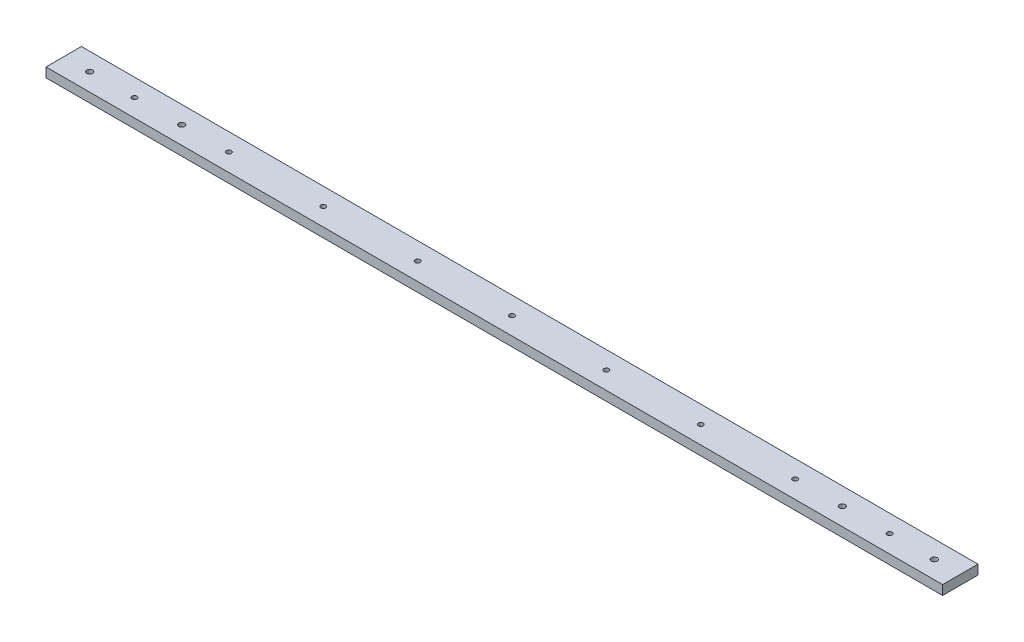
ISO-10303-21;
HEADER;
FILE_DESCRIPTION(('STEP AP214'),'2;1');
FILE_NAME('part.step','',(''),(''),'','','');
FILE_SCHEMA(('AUTOMOTIVE_DESIGN { 1 0 10303 214 1 1 1 1 }'));
ENDSEC;
DATA;
#1=APPLICATION_CONTEXT('core data for automotive mechanical design processes');
#2=APPLICATION_PROTOCOL_DEFINITION('international standard','automotive_design',2000,#1);
#3=PRODUCT_CONTEXT('',#1,'mechanical');
#4=PRODUCT('Part','Part','',(#3));
#5=PRODUCT_RELATED_PRODUCT_CATEGORY('part','',(#4));
#6=PRODUCT_DEFINITION_FORMATION('','',#4);
#7=PRODUCT_DEFINITION_CONTEXT('part definition',#1,'design');
#8=PRODUCT_DEFINITION('design','',#6,#7);
#9=PRODUCT_DEFINITION_SHAPE('','',#8);
#10=(LENGTH_UNIT() NAMED_UNIT(*) SI_UNIT(.MILLI.,.METRE.));
#11=(NAMED_UNIT(*) PLANE_ANGLE_UNIT() SI_UNIT($,.RADIAN.));
#12=(NAMED_UNIT(*) SI_UNIT($,.STERADIAN.) SOLID_ANGLE_UNIT());
#13=UNCERTAINTY_MEASURE_WITH_UNIT(LENGTH_MEASURE(1.E-05),#10,'distance_accuracy_value','');
#14=(GEOMETRIC_REPRESENTATION_CONTEXT(3) GLOBAL_UNCERTAINTY_ASSIGNED_CONTEXT((#13)) GLOBAL_UNIT_ASSIGNED_CONTEXT((#10,
#11,#12)) REPRESENTATION_CONTEXT('',''));
#15=CARTESIAN_POINT('',(0.,0.,0.));
#16=DIRECTION('',(0.,0.,1.));
#17=DIRECTION('',(1.,0.,0.));
#18=AXIS2_PLACEMENT_3D('',#15,#16,#17);
#19=CARTESIAN_POINT('',(380.,8.,-15.));
#20=DIRECTION('',(-1.,0.,0.));
#21=DIRECTION('',(0.,0.,1.));
#22=AXIS2_PLACEMENT_3D('',#19,#20,#21);
#23=PLANE('',#22);
#24=DIRECTION('',(0.,0.,-1.));
#25=VECTOR('',#24,1.);
#26=CARTESIAN_POINT('',(380.,0.,-15.));
#27=LINE('',#26,#25);
#28=CARTESIAN_POINT('',(380.,0.,15.));
#29=VERTEX_POINT('',#28);
#30=CARTESIAN_POINT('',(380.,0.,-15.));
#31=VERTEX_POINT('',#30);
#32=EDGE_CURVE('E111',#29,#31,#27,.T.);
#33=ORIENTED_EDGE('',*,*,#32,.T.);
#34=DIRECTION('',(0.,-1.,0.));
#35=VECTOR('',#34,1.);
#36=CARTESIAN_POINT('',(380.,8.,-15.));
#37=LINE('',#36,#35);
#38=CARTESIAN_POINT('',(380.,8.,-15.));
#39=VERTEX_POINT('',#38);
#40=EDGE_CURVE('E11',#39,#31,#37,.T.);
#41=ORIENTED_EDGE('',*,*,#40,.F.);
#42=DIRECTION('',(0.,0.,-1.));
#43=VECTOR('',#42,1.);
#44=CARTESIAN_POINT('',(380.,8.,-15.));
#45=LINE('',#44,#43);
#46=CARTESIAN_POINT('',(380.,8.,15.));
#47=VERTEX_POINT('',#46);
#48=EDGE_CURVE('E95',#47,#39,#45,.T.);
#49=ORIENTED_EDGE('',*,*,#48,.F.);
#50=DIRECTION('',(0.,-1.,0.));
#51=VECTOR('',#50,1.);
#52=CARTESIAN_POINT('',(380.,8.,15.));
#53=LINE('',#52,#51);
#54=EDGE_CURVE('E107',#47,#29,#53,.T.);
#55=ORIENTED_EDGE('',*,*,#54,.T.);
#56=EDGE_LOOP('',(#33,#41,#49,#55));
#57=FACE_BOUND('',#56,.T.);
#58=ADVANCED_FACE('F43',(#57),#23,.F.);
#59=CARTESIAN_POINT('',(-380.,8.,-15.));
#60=DIRECTION('',(0.,0.,1.));
#61=DIRECTION('',(1.,0.,0.));
#62=AXIS2_PLACEMENT_3D('',#59,#60,#61);
#63=PLANE('',#62);
#64=DIRECTION('',(-1.,0.,0.));
#65=VECTOR('',#64,1.);
#66=CARTESIAN_POINT('',(-380.,0.,-15.));
#67=LINE('',#66,#65);
#68=CARTESIAN_POINT('',(-380.,0.,-15.));
#69=VERTEX_POINT('',#68);
#70=EDGE_CURVE('E100',#31,#69,#67,.T.);
#71=ORIENTED_EDGE('',*,*,#70,.T.);
#72=DIRECTION('',(0.,-1.,0.));
#73=VECTOR('',#72,1.);
#74=CARTESIAN_POINT('',(-380.,8.,-15.));
#75=LINE('',#74,#73);
#76=CARTESIAN_POINT('',(-380.,8.,-15.));
#77=VERTEX_POINT('',#76);
#78=EDGE_CURVE('E52',#77,#69,#75,.T.);
#79=ORIENTED_EDGE('',*,*,#78,.F.);
#80=DIRECTION('',(-1.,0.,0.));
#81=VECTOR('',#80,1.);
#82=CARTESIAN_POINT('',(-380.,8.,-15.));
#83=LINE('',#82,#81);
#84=EDGE_CURVE('E90',#39,#77,#83,.T.);
#85=ORIENTED_EDGE('',*,*,#84,.F.);
#86=ORIENTED_EDGE('',*,*,#40,.T.);
#87=EDGE_LOOP('',(#71,#79,#85,#86));
#88=FACE_BOUND('',#87,.T.);
#89=ADVANCED_FACE('F99',(#88),#63,.F.);
#90=CARTESIAN_POINT('',(-380.,8.,-15.));
#91=DIRECTION('',(1.,0.,0.));
#92=DIRECTION('',(0.,0.,-1.));
#93=AXIS2_PLACEMENT_3D('',#90,#91,#92);
#94=PLANE('',#93);
#95=DIRECTION('',(0.,0.,1.));
#96=VECTOR('',#95,1.);
#97=CARTESIAN_POINT('',(-380.,0.,-15.));
#98=LINE('',#97,#96);
#99=CARTESIAN_POINT('',(-380.,0.,15.));
#100=VERTEX_POINT('',#99);
#101=EDGE_CURVE('E77',#69,#100,#98,.T.);
#102=ORIENTED_EDGE('',*,*,#101,.T.);
#103=DIRECTION('',(0.,-1.,0.));
#104=VECTOR('',#103,1.);
#105=CARTESIAN_POINT('',(-380.,8.,15.));
#106=LINE('',#105,#104);
#107=CARTESIAN_POINT('',(-380.,8.,15.));
#108=VERTEX_POINT('',#107);
#109=EDGE_CURVE('E102',#108,#100,#106,.T.);
#110=ORIENTED_EDGE('',*,*,#109,.F.);
#111=DIRECTION('',(0.,0.,1.));
#112=VECTOR('',#111,1.);
#113=CARTESIAN_POINT('',(-380.,8.,-15.));
#114=LINE('',#113,#112);
#115=EDGE_CURVE('E93',#77,#108,#114,.T.);
#116=ORIENTED_EDGE('',*,*,#115,.F.);
#117=ORIENTED_EDGE('',*,*,#78,.T.);
#118=EDGE_LOOP('',(#102,#110,#116,#117));
#119=FACE_BOUND('',#118,.T.);
#120=ADVANCED_FACE('F103',(#119),#94,.F.);
#121=CARTESIAN_POINT('',(-380.,8.,15.));
#122=DIRECTION('',(0.,0.,-1.));
#123=DIRECTION('',(-1.,0.,0.));
#124=AXIS2_PLACEMENT_3D('',#121,#122,#123);
#125=PLANE('',#124);
#126=DIRECTION('',(1.,0.,0.));
#127=VECTOR('',#126,1.);
#128=CARTESIAN_POINT('',(-380.,0.,15.));
#129=LINE('',#128,#127);
#130=EDGE_CURVE('E83',#100,#29,#129,.T.);
#131=ORIENTED_EDGE('',*,*,#130,.T.);
#132=ORIENTED_EDGE('',*,*,#54,.F.);
#133=DIRECTION('',(1.,0.,0.));
#134=VECTOR('',#133,1.);
#135=CARTESIAN_POINT('',(-380.,8.,15.));
#136=LINE('',#135,#134);
#137=EDGE_CURVE('E60',#108,#47,#136,.T.);
#138=ORIENTED_EDGE('',*,*,#137,.F.);
#139=ORIENTED_EDGE('',*,*,#109,.T.);
#140=EDGE_LOOP('',(#131,#132,#138,#139));
#141=FACE_BOUND('',#140,.T.);
#142=ADVANCED_FACE('F125',(#141),#125,.F.);
#143=CARTESIAN_POINT('',(0.,8.,0.));
#144=DIRECTION('',(0.,1.,0.));
#145=DIRECTION('',(0.,0.,1.));
#146=AXIS2_PLACEMENT_3D('',#143,#144,#145);
#147=PLANE('',#146);
#148=CARTESIAN_POINT('',(0.,8.,0.));
#149=DIRECTION('',(0.,1.,0.));
#150=DIRECTION('',(0.,0.,1.));
#151=AXIS2_PLACEMENT_3D('',#148,#149,#150);
#152=CIRCLE('',#151,2.1);
#153=CARTESIAN_POINT('',(0.,8.,2.1));
#154=VERTEX_POINT('',#153);
#155=EDGE_CURVE('E231',#154,#154,#152,.T.);
#156=ORIENTED_EDGE('',*,*,#155,.F.);
#157=EDGE_LOOP('',(#156));
#158=FACE_BOUND('',#157,.T.);
#159=CARTESIAN_POINT('',(80.,8.,0.));
#160=DIRECTION('',(0.,1.,0.));
#161=DIRECTION('',(0.,0.,1.));
#162=AXIS2_PLACEMENT_3D('',#159,#160,#161);
#163=CIRCLE('',#162,2.1);
#164=CARTESIAN_POINT('',(80.,8.,2.1));
#165=VERTEX_POINT('',#164);
#166=EDGE_CURVE('E223',#165,#165,#163,.T.);
#167=ORIENTED_EDGE('',*,*,#166,.F.);
#168=EDGE_LOOP('',(#167));
#169=FACE_BOUND('',#168,.T.);
#170=CARTESIAN_POINT('',(160.,8.,0.));
#171=DIRECTION('',(0.,1.,0.));
#172=DIRECTION('',(0.,0.,1.));
#173=AXIS2_PLACEMENT_3D('',#170,#171,#172);
#174=CIRCLE('',#173,2.09999999999999);
#175=CARTESIAN_POINT('',(160.,8.,2.09999999999999));
#176=VERTEX_POINT('',#175);
#177=EDGE_CURVE('E215',#176,#176,#174,.T.);
#178=ORIENTED_EDGE('',*,*,#177,.F.);
#179=EDGE_LOOP('',(#178));
#180=FACE_BOUND('',#179,.T.);
#181=CARTESIAN_POINT('',(240.,8.,0.));
#182=DIRECTION('',(0.,1.,0.));
#183=DIRECTION('',(0.,0.,1.));
#184=AXIS2_PLACEMENT_3D('',#181,#182,#183);
#185=CIRCLE('',#184,2.09999999999999);
#186=CARTESIAN_POINT('',(240.,8.,2.09999999999999));
#187=VERTEX_POINT('',#186);
#188=EDGE_CURVE('E207',#187,#187,#185,.T.);
#189=ORIENTED_EDGE('',*,*,#188,.F.);
#190=EDGE_LOOP('',(#189));
#191=FACE_BOUND('',#190,.T.);
#192=CARTESIAN_POINT('',(320.,8.,0.));
#193=DIRECTION('',(0.,1.,0.));
#194=DIRECTION('',(0.,0.,1.));
#195=AXIS2_PLACEMENT_3D('',#192,#193,#194);
#196=CIRCLE('',#195,2.09999999999999);
#197=CARTESIAN_POINT('',(320.,8.,2.09999999999999));
#198=VERTEX_POINT('',#197);
#199=EDGE_CURVE('E199',#198,#198,#196,.T.);
#200=ORIENTED_EDGE('',*,*,#199,.F.);
#201=EDGE_LOOP('',(#200));
#202=FACE_BOUND('',#201,.T.);
#203=CARTESIAN_POINT('',(-80.,8.,0.));
#204=DIRECTION('',(0.,1.,0.));
#205=DIRECTION('',(0.,0.,1.));
#206=AXIS2_PLACEMENT_3D('',#203,#204,#205);
#207=CIRCLE('',#206,2.1);
#208=CARTESIAN_POINT('',(-80.,8.,2.1));
#209=VERTEX_POINT('',#208);
#210=EDGE_CURVE('E191',#209,#209,#207,.T.);
#211=ORIENTED_EDGE('',*,*,#210,.F.);
#212=EDGE_LOOP('',(#211));
#213=FACE_BOUND('',#212,.T.);
#214=CARTESIAN_POINT('',(-160.,8.,0.));
#215=DIRECTION('',(0.,1.,0.));
#216=DIRECTION('',(0.,0.,1.));
#217=AXIS2_PLACEMENT_3D('',#214,#215,#216);
#218=CIRCLE('',#217,2.09999999999999);
#219=CARTESIAN_POINT('',(-160.,8.,2.09999999999999));
#220=VERTEX_POINT('',#219);
#221=EDGE_CURVE('E183',#220,#220,#218,.T.);
#222=ORIENTED_EDGE('',*,*,#221,.F.);
#223=EDGE_LOOP('',(#222));
#224=FACE_BOUND('',#223,.T.);
#225=CARTESIAN_POINT('',(-240.,8.,0.));
#226=DIRECTION('',(0.,1.,0.));
#227=DIRECTION('',(0.,0.,1.));
#228=AXIS2_PLACEMENT_3D('',#225,#226,#227);
#229=CIRCLE('',#228,2.09999999999999);
#230=CARTESIAN_POINT('',(-240.,8.,2.09999999999999));
#231=VERTEX_POINT('',#230);
#232=EDGE_CURVE('E175',#231,#231,#229,.T.);
#233=ORIENTED_EDGE('',*,*,#232,.F.);
#234=EDGE_LOOP('',(#233));
#235=FACE_BOUND('',#234,.T.);
#236=CARTESIAN_POINT('',(-320.,8.,0.));
#237=DIRECTION('',(0.,1.,0.));
#238=DIRECTION('',(0.,0.,1.));
#239=AXIS2_PLACEMENT_3D('',#236,#237,#238);
#240=CIRCLE('',#239,2.09999999999999);
#241=CARTESIAN_POINT('',(-320.,8.,2.09999999999999));
#242=VERTEX_POINT('',#241);
#243=EDGE_CURVE('E167',#242,#242,#240,.T.);
#244=ORIENTED_EDGE('',*,*,#243,.F.);
#245=EDGE_LOOP('',(#244));
#246=FACE_BOUND('',#245,.T.);
#247=CARTESIAN_POINT('',(-358.,8.,0.));
#248=DIRECTION('',(0.,1.,0.));
#249=DIRECTION('',(0.,0.,1.));
#250=AXIS2_PLACEMENT_3D('',#247,#248,#249);
#251=CIRCLE('',#250,2.5);
#252=CARTESIAN_POINT('',(-358.,8.,2.5));
#253=VERTEX_POINT('',#252);
#254=EDGE_CURVE('E159',#253,#253,#251,.T.);
#255=ORIENTED_EDGE('',*,*,#254,.F.);
#256=EDGE_LOOP('',(#255));
#257=FACE_BOUND('',#256,.T.);
#258=CARTESIAN_POINT('',(-280.,8.,0.));
#259=DIRECTION('',(0.,1.,0.));
#260=DIRECTION('',(0.,0.,1.));
#261=AXIS2_PLACEMENT_3D('',#258,#259,#260);
#262=CIRCLE('',#261,2.5);
#263=CARTESIAN_POINT('',(-280.,8.,2.5));
#264=VERTEX_POINT('',#263);
#265=EDGE_CURVE('E151',#264,#264,#262,.T.);
#266=ORIENTED_EDGE('',*,*,#265,.F.);
#267=EDGE_LOOP('',(#266));
#268=FACE_BOUND('',#267,.T.);
#269=CARTESIAN_POINT('',(280.,8.,0.));
#270=DIRECTION('',(0.,1.,0.));
#271=DIRECTION('',(0.,0.,1.));
#272=AXIS2_PLACEMENT_3D('',#269,#270,#271);
#273=CIRCLE('',#272,2.5);
#274=CARTESIAN_POINT('',(280.,8.,2.49999999999993));
#275=VERTEX_POINT('',#274);
#276=EDGE_CURVE('E143',#275,#275,#273,.T.);
#277=ORIENTED_EDGE('',*,*,#276,.F.);
#278=EDGE_LOOP('',(#277));
#279=FACE_BOUND('',#278,.T.);
#280=CARTESIAN_POINT('',(358.,8.,0.));
#281=DIRECTION('',(0.,1.,0.));
#282=DIRECTION('',(0.,0.,1.));
#283=AXIS2_PLACEMENT_3D('',#280,#281,#282);
#284=CIRCLE('',#283,2.5);
#285=CARTESIAN_POINT('',(358.,8.,2.49999999999991));
#286=VERTEX_POINT('',#285);
#287=EDGE_CURVE('E135',#286,#286,#284,.T.);
#288=ORIENTED_EDGE('',*,*,#287,.F.);
#289=EDGE_LOOP('',(#288));
#290=FACE_BOUND('',#289,.T.);
#291=ORIENTED_EDGE('',*,*,#48,.T.);
#292=ORIENTED_EDGE('',*,*,#84,.T.);
#293=ORIENTED_EDGE('',*,*,#115,.T.);
#294=ORIENTED_EDGE('',*,*,#137,.T.);
#295=EDGE_LOOP('',(#291,#292,#293,#294));
#296=FACE_BOUND('',#295,.T.);
#297=ADVANCED_FACE('F91',(#158,#169,#180,#191,#202,#213,#224,#235,#246,#257,#268,#279,#290,
#296),#147,.T.);
#298=CARTESIAN_POINT('',(0.,0.,0.));
#299=DIRECTION('',(0.,1.,0.));
#300=DIRECTION('',(0.,0.,1.));
#301=AXIS2_PLACEMENT_3D('',#298,#299,#300);
#302=PLANE('',#301);
#303=CARTESIAN_POINT('',(0.,0.,0.));
#304=DIRECTION('',(0.,1.,0.));
#305=DIRECTION('',(0.,0.,1.));
#306=AXIS2_PLACEMENT_3D('',#303,#304,#305);
#307=CIRCLE('',#306,2.1);
#308=CARTESIAN_POINT('',(0.,0.,2.1));
#309=VERTEX_POINT('',#308);
#310=EDGE_CURVE('E227',#309,#309,#307,.T.);
#311=ORIENTED_EDGE('',*,*,#310,.T.);
#312=EDGE_LOOP('',(#311));
#313=FACE_BOUND('',#312,.T.);
#314=CARTESIAN_POINT('',(80.,0.,0.));
#315=DIRECTION('',(0.,1.,0.));
#316=DIRECTION('',(0.,0.,1.));
#317=AXIS2_PLACEMENT_3D('',#314,#315,#316);
#318=CIRCLE('',#317,2.1);
#319=CARTESIAN_POINT('',(80.,0.,2.1));
#320=VERTEX_POINT('',#319);
#321=EDGE_CURVE('E219',#320,#320,#318,.T.);
#322=ORIENTED_EDGE('',*,*,#321,.T.);
#323=EDGE_LOOP('',(#322));
#324=FACE_BOUND('',#323,.T.);
#325=CARTESIAN_POINT('',(160.,0.,0.));
#326=DIRECTION('',(0.,1.,0.));
#327=DIRECTION('',(0.,0.,1.));
#328=AXIS2_PLACEMENT_3D('',#325,#326,#327);
#329=CIRCLE('',#328,2.09999999999999);
#330=CARTESIAN_POINT('',(160.,0.,2.09999999999999));
#331=VERTEX_POINT('',#330);
#332=EDGE_CURVE('E211',#331,#331,#329,.T.);
#333=ORIENTED_EDGE('',*,*,#332,.T.);
#334=EDGE_LOOP('',(#333));
#335=FACE_BOUND('',#334,.T.);
#336=CARTESIAN_POINT('',(240.,0.,0.));
#337=DIRECTION('',(0.,1.,0.));
#338=DIRECTION('',(0.,0.,1.));
#339=AXIS2_PLACEMENT_3D('',#336,#337,#338);
#340=CIRCLE('',#339,2.09999999999999);
#341=CARTESIAN_POINT('',(240.,0.,2.09999999999999));
#342=VERTEX_POINT('',#341);
#343=EDGE_CURVE('E203',#342,#342,#340,.T.);
#344=ORIENTED_EDGE('',*,*,#343,.T.);
#345=EDGE_LOOP('',(#344));
#346=FACE_BOUND('',#345,.T.);
#347=CARTESIAN_POINT('',(320.,0.,0.));
#348=DIRECTION('',(0.,1.,0.));
#349=DIRECTION('',(0.,0.,1.));
#350=AXIS2_PLACEMENT_3D('',#347,#348,#349);
#351=CIRCLE('',#350,2.09999999999999);
#352=CARTESIAN_POINT('',(320.,0.,2.09999999999999));
#353=VERTEX_POINT('',#352);
#354=EDGE_CURVE('E195',#353,#353,#351,.T.);
#355=ORIENTED_EDGE('',*,*,#354,.T.);
#356=EDGE_LOOP('',(#355));
#357=FACE_BOUND('',#356,.T.);
#358=CARTESIAN_POINT('',(-80.,0.,0.));
#359=DIRECTION('',(0.,1.,0.));
#360=DIRECTION('',(0.,0.,1.));
#361=AXIS2_PLACEMENT_3D('',#358,#359,#360);
#362=CIRCLE('',#361,2.1);
#363=CARTESIAN_POINT('',(-80.,0.,2.1));
#364=VERTEX_POINT('',#363);
#365=EDGE_CURVE('E187',#364,#364,#362,.T.);
#366=ORIENTED_EDGE('',*,*,#365,.T.);
#367=EDGE_LOOP('',(#366));
#368=FACE_BOUND('',#367,.T.);
#369=CARTESIAN_POINT('',(-160.,0.,0.));
#370=DIRECTION('',(0.,1.,0.));
#371=DIRECTION('',(0.,0.,1.));
#372=AXIS2_PLACEMENT_3D('',#369,#370,#371);
#373=CIRCLE('',#372,2.09999999999999);
#374=CARTESIAN_POINT('',(-160.,0.,2.09999999999999));
#375=VERTEX_POINT('',#374);
#376=EDGE_CURVE('E179',#375,#375,#373,.T.);
#377=ORIENTED_EDGE('',*,*,#376,.T.);
#378=EDGE_LOOP('',(#377));
#379=FACE_BOUND('',#378,.T.);
#380=CARTESIAN_POINT('',(-240.,0.,0.));
#381=DIRECTION('',(0.,1.,0.));
#382=DIRECTION('',(0.,0.,1.));
#383=AXIS2_PLACEMENT_3D('',#380,#381,#382);
#384=CIRCLE('',#383,2.09999999999999);
#385=CARTESIAN_POINT('',(-240.,0.,2.09999999999999));
#386=VERTEX_POINT('',#385);
#387=EDGE_CURVE('E171',#386,#386,#384,.T.);
#388=ORIENTED_EDGE('',*,*,#387,.T.);
#389=EDGE_LOOP('',(#388));
#390=FACE_BOUND('',#389,.T.);
#391=CARTESIAN_POINT('',(-320.,0.,0.));
#392=DIRECTION('',(0.,1.,0.));
#393=DIRECTION('',(0.,0.,1.));
#394=AXIS2_PLACEMENT_3D('',#391,#392,#393);
#395=CIRCLE('',#394,2.09999999999999);
#396=CARTESIAN_POINT('',(-320.,0.,2.09999999999999));
#397=VERTEX_POINT('',#396);
#398=EDGE_CURVE('E163',#397,#397,#395,.T.);
#399=ORIENTED_EDGE('',*,*,#398,.T.);
#400=EDGE_LOOP('',(#399));
#401=FACE_BOUND('',#400,.T.);
#402=CARTESIAN_POINT('',(-358.,0.,0.));
#403=DIRECTION('',(0.,1.,0.));
#404=DIRECTION('',(0.,0.,1.));
#405=AXIS2_PLACEMENT_3D('',#402,#403,#404);
#406=CIRCLE('',#405,2.5);
#407=CARTESIAN_POINT('',(-358.,0.,2.5));
#408=VERTEX_POINT('',#407);
#409=EDGE_CURVE('E155',#408,#408,#406,.T.);
#410=ORIENTED_EDGE('',*,*,#409,.T.);
#411=EDGE_LOOP('',(#410));
#412=FACE_BOUND('',#411,.T.);
#413=CARTESIAN_POINT('',(-280.,0.,0.));
#414=DIRECTION('',(0.,1.,0.));
#415=DIRECTION('',(0.,0.,1.));
#416=AXIS2_PLACEMENT_3D('',#413,#414,#415);
#417=CIRCLE('',#416,2.5);
#418=CARTESIAN_POINT('',(-280.,0.,2.5));
#419=VERTEX_POINT('',#418);
#420=EDGE_CURVE('E147',#419,#419,#417,.T.);
#421=ORIENTED_EDGE('',*,*,#420,.T.);
#422=EDGE_LOOP('',(#421));
#423=FACE_BOUND('',#422,.T.);
#424=CARTESIAN_POINT('',(280.,0.,0.));
#425=DIRECTION('',(0.,1.,0.));
#426=DIRECTION('',(0.,0.,1.));
#427=AXIS2_PLACEMENT_3D('',#424,#425,#426);
#428=CIRCLE('',#427,2.5);
#429=CARTESIAN_POINT('',(280.,0.,2.49999999999993));
#430=VERTEX_POINT('',#429);
#431=EDGE_CURVE('E139',#430,#430,#428,.T.);
#432=ORIENTED_EDGE('',*,*,#431,.T.);
#433=EDGE_LOOP('',(#432));
#434=FACE_BOUND('',#433,.T.);
#435=CARTESIAN_POINT('',(358.,0.,0.));
#436=DIRECTION('',(0.,1.,0.));
#437=DIRECTION('',(0.,0.,1.));
#438=AXIS2_PLACEMENT_3D('',#435,#436,#437);
#439=CIRCLE('',#438,2.5);
#440=CARTESIAN_POINT('',(358.,0.,2.49999999999991));
#441=VERTEX_POINT('',#440);
#442=EDGE_CURVE('E115',#441,#441,#439,.T.);
#443=ORIENTED_EDGE('',*,*,#442,.T.);
#444=EDGE_LOOP('',(#443));
#445=FACE_BOUND('',#444,.T.);
#446=ORIENTED_EDGE('',*,*,#32,.F.);
#447=ORIENTED_EDGE('',*,*,#130,.F.);
#448=ORIENTED_EDGE('',*,*,#101,.F.);
#449=ORIENTED_EDGE('',*,*,#70,.F.);
#450=EDGE_LOOP('',(#446,#447,#448,#449));
#451=FACE_BOUND('',#450,.T.);
#452=ADVANCED_FACE('F128',(#313,#324,#335,#346,#357,#368,#379,#390,#401,#412,#423,#434,#445,
#451),#302,.F.);
#453=CARTESIAN_POINT('',(358.,8.,0.));
#454=DIRECTION('',(0.,1.,0.));
#455=DIRECTION('',(0.,0.,1.));
#456=AXIS2_PLACEMENT_3D('',#453,#454,#455);
#457=CYLINDRICAL_SURFACE('',#456,2.5);
#458=ORIENTED_EDGE('',*,*,#442,.F.);
#459=EDGE_LOOP('',(#458));
#460=FACE_BOUND('',#459,.T.);
#461=ORIENTED_EDGE('',*,*,#287,.T.);
#462=EDGE_LOOP('',(#461));
#463=FACE_BOUND('',#462,.T.);
#464=ADVANCED_FACE('F265',(#460,#463),#457,.F.);
#465=CARTESIAN_POINT('',(280.,8.,0.));
#466=DIRECTION('',(0.,1.,0.));
#467=DIRECTION('',(0.,0.,1.));
#468=AXIS2_PLACEMENT_3D('',#465,#466,#467);
#469=CYLINDRICAL_SURFACE('',#468,2.5);
#470=ORIENTED_EDGE('',*,*,#431,.F.);
#471=EDGE_LOOP('',(#470));
#472=FACE_BOUND('',#471,.T.);
#473=ORIENTED_EDGE('',*,*,#276,.T.);
#474=EDGE_LOOP('',(#473));
#475=FACE_BOUND('',#474,.T.);
#476=ADVANCED_FACE('F267',(#472,#475),#469,.F.);
#477=CARTESIAN_POINT('',(-280.,8.,0.));
#478=DIRECTION('',(0.,1.,0.));
#479=DIRECTION('',(0.,0.,1.));
#480=AXIS2_PLACEMENT_3D('',#477,#478,#479);
#481=CYLINDRICAL_SURFACE('',#480,2.5);
#482=ORIENTED_EDGE('',*,*,#420,.F.);
#483=EDGE_LOOP('',(#482));
#484=FACE_BOUND('',#483,.T.);
#485=ORIENTED_EDGE('',*,*,#265,.T.);
#486=EDGE_LOOP('',(#485));
#487=FACE_BOUND('',#486,.T.);
#488=ADVANCED_FACE('F274',(#484,#487),#481,.F.);
#489=CARTESIAN_POINT('',(-358.,8.,0.));
#490=DIRECTION('',(0.,1.,0.));
#491=DIRECTION('',(0.,0.,1.));
#492=AXIS2_PLACEMENT_3D('',#489,#490,#491);
#493=CYLINDRICAL_SURFACE('',#492,2.5);
#494=ORIENTED_EDGE('',*,*,#409,.F.);
#495=EDGE_LOOP('',(#494));
#496=FACE_BOUND('',#495,.T.);
#497=ORIENTED_EDGE('',*,*,#254,.T.);
#498=EDGE_LOOP('',(#497));
#499=FACE_BOUND('',#498,.T.);
#500=ADVANCED_FACE('F323',(#496,#499),#493,.F.);
#501=CARTESIAN_POINT('',(-320.,8.,0.));
#502=DIRECTION('',(0.,1.,0.));
#503=DIRECTION('',(0.,0.,1.));
#504=AXIS2_PLACEMENT_3D('',#501,#502,#503);
#505=CYLINDRICAL_SURFACE('',#504,2.09999999999999);
#506=ORIENTED_EDGE('',*,*,#398,.F.);
#507=EDGE_LOOP('',(#506));
#508=FACE_BOUND('',#507,.T.);
#509=ORIENTED_EDGE('',*,*,#243,.T.);
#510=EDGE_LOOP('',(#509));
#511=FACE_BOUND('',#510,.T.);
#512=ADVANCED_FACE('F316',(#508,#511),#505,.F.);
#513=CARTESIAN_POINT('',(-240.,8.,0.));
#514=DIRECTION('',(0.,1.,0.));
#515=DIRECTION('',(0.,0.,1.));
#516=AXIS2_PLACEMENT_3D('',#513,#514,#515);
#517=CYLINDRICAL_SURFACE('',#516,2.09999999999999);
#518=ORIENTED_EDGE('',*,*,#387,.F.);
#519=EDGE_LOOP('',(#518));
#520=FACE_BOUND('',#519,.T.);
#521=ORIENTED_EDGE('',*,*,#232,.T.);
#522=EDGE_LOOP('',(#521));
#523=FACE_BOUND('',#522,.T.);
#524=ADVANCED_FACE('F322',(#520,#523),#517,.F.);
#525=CARTESIAN_POINT('',(-160.,8.,0.));
#526=DIRECTION('',(0.,1.,0.));
#527=DIRECTION('',(0.,0.,1.));
#528=AXIS2_PLACEMENT_3D('',#525,#526,#527);
#529=CYLINDRICAL_SURFACE('',#528,2.09999999999999);
#530=ORIENTED_EDGE('',*,*,#376,.F.);
#531=EDGE_LOOP('',(#530));
#532=FACE_BOUND('',#531,.T.);
#533=ORIENTED_EDGE('',*,*,#221,.T.);
#534=EDGE_LOOP('',(#533));
#535=FACE_BOUND('',#534,.T.);
#536=ADVANCED_FACE('F337',(#532,#535),#529,.F.);
#537=CARTESIAN_POINT('',(-80.,8.,0.));
#538=DIRECTION('',(0.,1.,0.));
#539=DIRECTION('',(0.,0.,1.));
#540=AXIS2_PLACEMENT_3D('',#537,#538,#539);
#541=CYLINDRICAL_SURFACE('',#540,2.1);
#542=ORIENTED_EDGE('',*,*,#365,.F.);
#543=EDGE_LOOP('',(#542));
#544=FACE_BOUND('',#543,.T.);
#545=ORIENTED_EDGE('',*,*,#210,.T.);
#546=EDGE_LOOP('',(#545));
#547=FACE_BOUND('',#546,.T.);
#548=ADVANCED_FACE('F349',(#544,#547),#541,.F.);
#549=CARTESIAN_POINT('',(320.,8.,0.));
#550=DIRECTION('',(0.,1.,0.));
#551=DIRECTION('',(0.,0.,1.));
#552=AXIS2_PLACEMENT_3D('',#549,#550,#551);
#553=CYLINDRICAL_SURFACE('',#552,2.09999999999999);
#554=ORIENTED_EDGE('',*,*,#354,.F.);
#555=EDGE_LOOP('',(#554));
#556=FACE_BOUND('',#555,.T.);
#557=ORIENTED_EDGE('',*,*,#199,.T.);
#558=EDGE_LOOP('',(#557));
#559=FACE_BOUND('',#558,.T.);
#560=ADVANCED_FACE('F361',(#556,#559),#553,.F.);
#561=CARTESIAN_POINT('',(240.,8.,0.));
#562=DIRECTION('',(0.,1.,0.));
#563=DIRECTION('',(0.,0.,1.));
#564=AXIS2_PLACEMENT_3D('',#561,#562,#563);
#565=CYLINDRICAL_SURFACE('',#564,2.09999999999999);
#566=ORIENTED_EDGE('',*,*,#343,.F.);
#567=EDGE_LOOP('',(#566));
#568=FACE_BOUND('',#567,.T.);
#569=ORIENTED_EDGE('',*,*,#188,.T.);
#570=EDGE_LOOP('',(#569));
#571=FACE_BOUND('',#570,.T.);
#572=ADVANCED_FACE('F373',(#568,#571),#565,.F.);
#573=CARTESIAN_POINT('',(160.,8.,0.));
#574=DIRECTION('',(0.,1.,0.));
#575=DIRECTION('',(0.,0.,1.));
#576=AXIS2_PLACEMENT_3D('',#573,#574,#575);
#577=CYLINDRICAL_SURFACE('',#576,2.09999999999999);
#578=ORIENTED_EDGE('',*,*,#332,.F.);
#579=EDGE_LOOP('',(#578));
#580=FACE_BOUND('',#579,.T.);
#581=ORIENTED_EDGE('',*,*,#177,.T.);
#582=EDGE_LOOP('',(#581));
#583=FACE_BOUND('',#582,.T.);
#584=ADVANCED_FACE('F385',(#580,#583),#577,.F.);
#585=CARTESIAN_POINT('',(80.,8.,0.));
#586=DIRECTION('',(0.,1.,0.));
#587=DIRECTION('',(0.,0.,1.));
#588=AXIS2_PLACEMENT_3D('',#585,#586,#587);
#589=CYLINDRICAL_SURFACE('',#588,2.1);
#590=ORIENTED_EDGE('',*,*,#321,.F.);
#591=EDGE_LOOP('',(#590));
#592=FACE_BOUND('',#591,.T.);
#593=ORIENTED_EDGE('',*,*,#166,.T.);
#594=EDGE_LOOP('',(#593));
#595=FACE_BOUND('',#594,.T.);
#596=ADVANCED_FACE('F397',(#592,#595),#589,.F.);
#597=CARTESIAN_POINT('',(0.,8.,0.));
#598=DIRECTION('',(0.,1.,0.));
#599=DIRECTION('',(0.,0.,1.));
#600=AXIS2_PLACEMENT_3D('',#597,#598,#599);
#601=CYLINDRICAL_SURFACE('',#600,2.1);
#602=ORIENTED_EDGE('',*,*,#310,.F.);
#603=EDGE_LOOP('',(#602));
#604=FACE_BOUND('',#603,.T.);
#605=ORIENTED_EDGE('',*,*,#155,.T.);
#606=EDGE_LOOP('',(#605));
#607=FACE_BOUND('',#606,.T.);
#608=ADVANCED_FACE('F236',(#604,#607),#601,.F.);
#609=CLOSED_SHELL('',(#58,#89,#120,#142,#297,#452,#464,#476,#488,#500,#512,#524,#536,#548,#560,
#572,#584,#596,#608));
#610=MANIFOLD_SOLID_BREP('B2',#609);
#611=ADVANCED_BREP_SHAPE_REPRESENTATION('',(#18,#610),#14);
#612=SHAPE_DEFINITION_REPRESENTATION(#9,#611);
ENDSEC;
END-ISO-10303-21;
